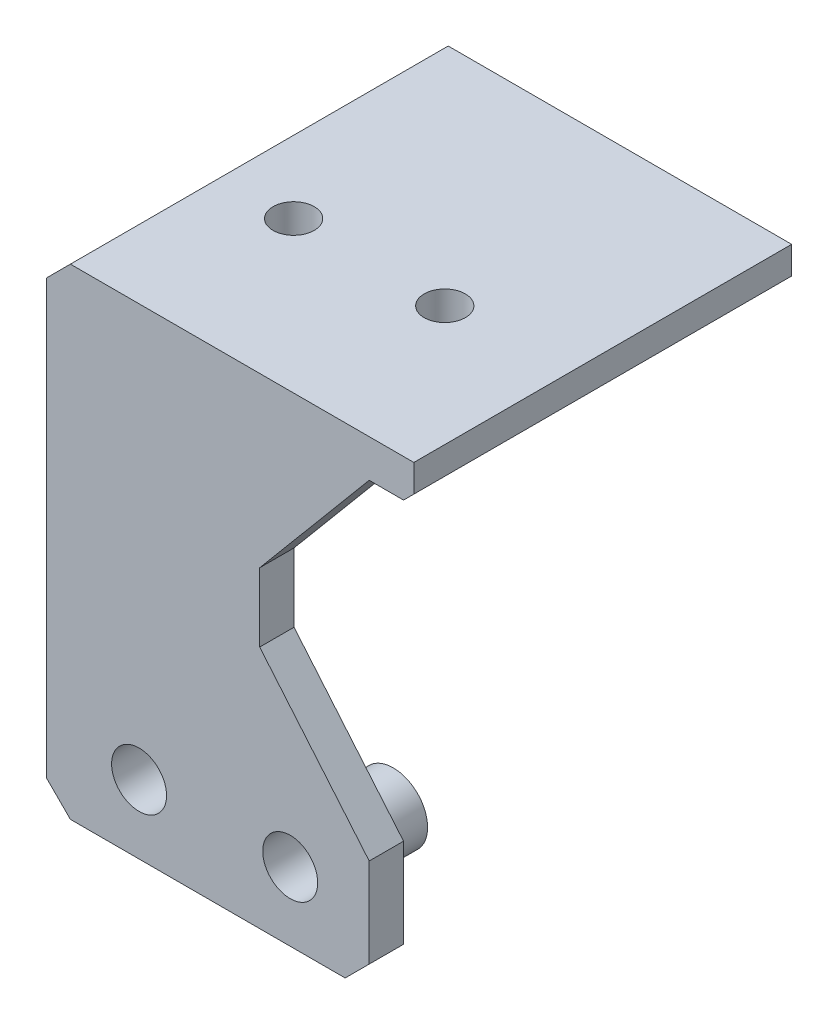
ISO-10303-21;
HEADER;
FILE_DESCRIPTION(('STEP AP214'),'2;1');
FILE_NAME('part.step','',(''),(''),'','','');
FILE_SCHEMA(('AUTOMOTIVE_DESIGN { 1 0 10303 214 1 1 1 1 }'));
ENDSEC;
DATA;
#1=APPLICATION_CONTEXT('core data for automotive mechanical design processes');
#2=APPLICATION_PROTOCOL_DEFINITION('international standard','automotive_design',2000,#1);
#3=PRODUCT_CONTEXT('',#1,'mechanical');
#4=PRODUCT('Part','Part','',(#3));
#5=PRODUCT_RELATED_PRODUCT_CATEGORY('part','',(#4));
#6=PRODUCT_DEFINITION_FORMATION('','',#4);
#7=PRODUCT_DEFINITION_CONTEXT('part definition',#1,'design');
#8=PRODUCT_DEFINITION('design','',#6,#7);
#9=PRODUCT_DEFINITION_SHAPE('','',#8);
#10=(LENGTH_UNIT() NAMED_UNIT(*) SI_UNIT(.MILLI.,.METRE.));
#11=(NAMED_UNIT(*) PLANE_ANGLE_UNIT() SI_UNIT($,.RADIAN.));
#12=(NAMED_UNIT(*) SI_UNIT($,.STERADIAN.) SOLID_ANGLE_UNIT());
#13=UNCERTAINTY_MEASURE_WITH_UNIT(LENGTH_MEASURE(1.E-05),#10,'distance_accuracy_value','');
#14=(GEOMETRIC_REPRESENTATION_CONTEXT(3) GLOBAL_UNCERTAINTY_ASSIGNED_CONTEXT((#13)) GLOBAL_UNIT_ASSIGNED_CONTEXT((#10,
#11,#12)) REPRESENTATION_CONTEXT('',''));
#15=CARTESIAN_POINT('',(0.,0.,0.));
#16=DIRECTION('',(0.,0.,1.));
#17=DIRECTION('',(1.,0.,0.));
#18=AXIS2_PLACEMENT_3D('',#15,#16,#17);
#19=CARTESIAN_POINT('',(10.5,0.,-17.));
#20=DIRECTION('',(0.,-1.,0.));
#21=DIRECTION('',(0.,0.,-1.));
#22=AXIS2_PLACEMENT_3D('',#19,#20,#21);
#23=CYLINDRICAL_SURFACE('',#22,3.);
#24=CARTESIAN_POINT('',(10.5,0.,-17.));
#25=DIRECTION('',(0.,-1.,0.));
#26=DIRECTION('',(0.,0.,-1.));
#27=AXIS2_PLACEMENT_3D('',#24,#25,#26);
#28=CIRCLE('',#27,3.);
#29=CARTESIAN_POINT('',(10.5,0.,-20.));
#30=VERTEX_POINT('',#29);
#31=EDGE_CURVE('E300',#30,#30,#28,.T.);
#32=ORIENTED_EDGE('',*,*,#31,.F.);
#33=EDGE_LOOP('',(#32));
#34=FACE_BOUND('',#33,.T.);
#35=CARTESIAN_POINT('',(10.5,-4.50000000000006,-17.));
#36=DIRECTION('',(0.,-1.,0.));
#37=DIRECTION('',(0.,0.,-1.));
#38=AXIS2_PLACEMENT_3D('',#35,#36,#37);
#39=CIRCLE('',#38,3.);
#40=CARTESIAN_POINT('',(10.5,-4.50000000000006,-20.));
#41=VERTEX_POINT('',#40);
#42=EDGE_CURVE('E360',#41,#41,#39,.T.);
#43=ORIENTED_EDGE('',*,*,#42,.T.);
#44=EDGE_LOOP('',(#43));
#45=FACE_BOUND('',#44,.T.);
#46=ADVANCED_FACE('F66',(#34,#45),#23,.F.);
#47=CARTESIAN_POINT('',(32.5,0.,-17.));
#48=DIRECTION('',(0.,-1.,0.));
#49=DIRECTION('',(0.,0.,-1.));
#50=AXIS2_PLACEMENT_3D('',#47,#48,#49);
#51=CYLINDRICAL_SURFACE('',#50,3.);
#52=CARTESIAN_POINT('',(32.5,0.,-17.));
#53=DIRECTION('',(0.,-1.,0.));
#54=DIRECTION('',(0.,0.,-1.));
#55=AXIS2_PLACEMENT_3D('',#52,#53,#54);
#56=CIRCLE('',#55,3.);
#57=CARTESIAN_POINT('',(32.5,0.,-20.));
#58=VERTEX_POINT('',#57);
#59=EDGE_CURVE('E294',#58,#58,#56,.T.);
#60=ORIENTED_EDGE('',*,*,#59,.F.);
#61=EDGE_LOOP('',(#60));
#62=FACE_BOUND('',#61,.T.);
#63=CARTESIAN_POINT('',(32.5,-4.50000000000006,-17.));
#64=DIRECTION('',(0.,-1.,0.));
#65=DIRECTION('',(0.,0.,-1.));
#66=AXIS2_PLACEMENT_3D('',#63,#64,#65);
#67=CIRCLE('',#66,3.);
#68=CARTESIAN_POINT('',(32.5,-4.50000000000006,-20.));
#69=VERTEX_POINT('',#68);
#70=EDGE_CURVE('E347',#69,#69,#67,.T.);
#71=ORIENTED_EDGE('',*,*,#70,.T.);
#72=EDGE_LOOP('',(#71));
#73=FACE_BOUND('',#72,.T.);
#74=ADVANCED_FACE('F401',(#62,#73),#51,.F.);
#75=CARTESIAN_POINT('',(0.,0.,0.));
#76=DIRECTION('',(0.,0.,1.));
#77=DIRECTION('',(1.,0.,0.));
#78=AXIS2_PLACEMENT_3D('',#75,#76,#77);
#79=PLANE('',#78);
#80=CARTESIAN_POINT('',(10.0000000000001,-59.9999999999999,0.));
#81=DIRECTION('',(0.,0.,1.));
#82=DIRECTION('',(1.,0.,0.));
#83=AXIS2_PLACEMENT_3D('',#80,#81,#82);
#84=CIRCLE('',#83,5.);
#85=CARTESIAN_POINT('',(15.0000000000001,-59.9999999999999,0.));
#86=VERTEX_POINT('',#85);
#87=EDGE_CURVE('E14',#86,#86,#84,.F.);
#88=ORIENTED_EDGE('',*,*,#87,.F.);
#89=EDGE_LOOP('',(#88));
#90=FACE_BOUND('',#89,.T.);
#91=CARTESIAN_POINT('',(32.0000000000001,-59.9999999999999,0.));
#92=DIRECTION('',(0.,0.,1.));
#93=DIRECTION('',(1.,0.,0.));
#94=AXIS2_PLACEMENT_3D('',#91,#92,#93);
#95=CIRCLE('',#94,5.);
#96=CARTESIAN_POINT('',(37.0000000000001,-59.9999999999999,0.));
#97=VERTEX_POINT('',#96);
#98=EDGE_CURVE('E75',#97,#97,#95,.F.);
#99=ORIENTED_EDGE('',*,*,#98,.F.);
#100=EDGE_LOOP('',(#99));
#101=FACE_BOUND('',#100,.T.);
#102=DIRECTION('',(-1.,0.,0.));
#103=VECTOR('',#102,1.);
#104=CARTESIAN_POINT('',(45.5,-8.50000000000006,0.));
#105=LINE('',#104,#103);
#106=CARTESIAN_POINT('',(40.9827011064682,-8.50000000000006,0.));
#107=VERTEX_POINT('',#106);
#108=CARTESIAN_POINT('',(-3.49999999999995,-8.50000000000006,0.));
#109=VERTEX_POINT('',#108);
#110=EDGE_CURVE('E82',#107,#109,#105,.T.);
#111=ORIENTED_EDGE('',*,*,#110,.F.);
#112=DIRECTION('',(0.642787609686536,0.766044443118981,0.));
#113=VECTOR('',#112,1.);
#114=CARTESIAN_POINT('',(28.2350691850395,-23.6920361394314,0.));
#115=LINE('',#114,#113);
#116=CARTESIAN_POINT('',(27.5571070076319,-24.5,0.));
#117=VERTEX_POINT('',#116);
#118=EDGE_CURVE('E223',#117,#107,#115,.T.);
#119=ORIENTED_EDGE('',*,*,#118,.F.);
#120=DIRECTION('',(0.,1.,0.));
#121=VECTOR('',#120,1.);
#122=CARTESIAN_POINT('',(27.5571070076319,0.,0.));
#123=LINE('',#122,#121);
#124=CARTESIAN_POINT('',(27.5571070076319,-34.5,0.));
#125=VERTEX_POINT('',#124);
#126=EDGE_CURVE('E219',#125,#117,#123,.T.);
#127=ORIENTED_EDGE('',*,*,#126,.F.);
#128=DIRECTION('',(-0.642787609686536,0.766044443118981,0.));
#129=VECTOR('',#128,1.);
#130=CARTESIAN_POINT('',(-0.816759528820599,-0.685342619393903,0.));
#131=LINE('',#130,#129);
#132=CARTESIAN_POINT('',(43.5000000000001,-53.5,0.));
#133=VERTEX_POINT('',#132);
#134=EDGE_CURVE('E216',#133,#125,#131,.T.);
#135=ORIENTED_EDGE('',*,*,#134,.F.);
#136=DIRECTION('',(0.,1.,0.));
#137=VECTOR('',#136,1.);
#138=CARTESIAN_POINT('',(43.5,0.,0.));
#139=LINE('',#138,#137);
#140=CARTESIAN_POINT('',(43.5000000000001,-66.5,0.));
#141=VERTEX_POINT('',#140);
#142=EDGE_CURVE('E213',#141,#133,#139,.T.);
#143=ORIENTED_EDGE('',*,*,#142,.F.);
#144=DIRECTION('',(-0.707106781186548,-0.707106781186548,0.));
#145=VECTOR('',#144,1.);
#146=CARTESIAN_POINT('',(55.,-55.,0.));
#147=LINE('',#146,#145);
#148=CARTESIAN_POINT('',(40.0000000000001,-70.,0.));
#149=VERTEX_POINT('',#148);
#150=EDGE_CURVE('E209',#141,#149,#147,.T.);
#151=ORIENTED_EDGE('',*,*,#150,.T.);
#152=DIRECTION('',(1.,0.,0.));
#153=VECTOR('',#152,1.);
#154=CARTESIAN_POINT('',(0.,-70.,0.));
#155=LINE('',#154,#153);
#156=CARTESIAN_POINT('',(1.11022302462516E-13,-70.,0.));
#157=VERTEX_POINT('',#156);
#158=EDGE_CURVE('E205',#157,#149,#155,.T.);
#159=ORIENTED_EDGE('',*,*,#158,.F.);
#160=DIRECTION('',(0.707106781186553,-0.707106781186543,0.));
#161=VECTOR('',#160,1.);
#162=CARTESIAN_POINT('',(-34.9999999999999,-35.0000000000005,0.));
#163=LINE('',#162,#161);
#164=CARTESIAN_POINT('',(-3.49999999999995,-66.5,0.));
#165=VERTEX_POINT('',#164);
#166=EDGE_CURVE('E201',#165,#157,#163,.T.);
#167=ORIENTED_EDGE('',*,*,#166,.F.);
#168=DIRECTION('',(0.,-1.,0.));
#169=VECTOR('',#168,1.);
#170=CARTESIAN_POINT('',(-3.5,0.,0.));
#171=LINE('',#170,#169);
#172=EDGE_CURVE('E198',#109,#165,#171,.T.);
#173=ORIENTED_EDGE('',*,*,#172,.F.);
#174=EDGE_LOOP('',(#111,#119,#127,#135,#143,#151,#159,#167,#173));
#175=FACE_BOUND('',#174,.T.);
#176=ADVANCED_FACE('F407',(#90,#101,#175),#79,.F.);
#177=CARTESIAN_POINT('',(0.,0.,5.));
#178=DIRECTION('',(0.,-1.,0.));
#179=DIRECTION('',(1.,0.,0.));
#180=AXIS2_PLACEMENT_3D('',#177,#178,#179);
#181=PLANE('',#180);
#182=ORIENTED_EDGE('',*,*,#59,.T.);
#183=EDGE_LOOP('',(#182));
#184=FACE_BOUND('',#183,.T.);
#185=ORIENTED_EDGE('',*,*,#31,.T.);
#186=EDGE_LOOP('',(#185));
#187=FACE_BOUND('',#186,.T.);
#188=DIRECTION('',(0.,0.,-1.));
#189=VECTOR('',#188,1.);
#190=CARTESIAN_POINT('',(50.,0.,5.));
#191=LINE('',#190,#189);
#192=CARTESIAN_POINT('',(50.,0.,5.));
#193=VERTEX_POINT('',#192);
#194=CARTESIAN_POINT('',(50.,0.,-50.));
#195=VERTEX_POINT('',#194);
#196=EDGE_CURVE('E194',#193,#195,#191,.T.);
#197=ORIENTED_EDGE('',*,*,#196,.T.);
#198=DIRECTION('',(1.,0.,0.));
#199=VECTOR('',#198,1.);
#200=CARTESIAN_POINT('',(0.,0.,-50.));
#201=LINE('',#200,#199);
#202=CARTESIAN_POINT('',(0.,0.,-50.));
#203=VERTEX_POINT('',#202);
#204=EDGE_CURVE('E284',#203,#195,#201,.T.);
#205=ORIENTED_EDGE('',*,*,#204,.F.);
#206=DIRECTION('',(0.,0.,-1.));
#207=VECTOR('',#206,1.);
#208=CARTESIAN_POINT('',(0.,0.,5.));
#209=LINE('',#208,#207);
#210=CARTESIAN_POINT('',(0.,0.,5.));
#211=VERTEX_POINT('',#210);
#212=EDGE_CURVE('E266',#211,#203,#209,.T.);
#213=ORIENTED_EDGE('',*,*,#212,.F.);
#214=DIRECTION('',(-1.,0.,0.));
#215=VECTOR('',#214,1.);
#216=CARTESIAN_POINT('',(0.,0.,5.));
#217=LINE('',#216,#215);
#218=EDGE_CURVE('E228',#193,#211,#217,.T.);
#219=ORIENTED_EDGE('',*,*,#218,.F.);
#220=EDGE_LOOP('',(#197,#205,#213,#219));
#221=FACE_BOUND('',#220,.T.);
#222=ADVANCED_FACE('F68',(#184,#187,#221),#181,.F.);
#223=CARTESIAN_POINT('',(0.,0.,5.));
#224=DIRECTION('',(0.707106781186553,-0.707106781186543,0.));
#225=DIRECTION('',(0.707106781186543,0.707106781186553,0.));
#226=AXIS2_PLACEMENT_3D('',#223,#224,#225);
#227=PLANE('',#226);
#228=ORIENTED_EDGE('',*,*,#212,.T.);
#229=DIRECTION('',(0.707106781186544,0.707106781186552,0.));
#230=VECTOR('',#229,1.);
#231=CARTESIAN_POINT('',(-3.5,-3.50000000000006,-50.));
#232=LINE('',#231,#230);
#233=CARTESIAN_POINT('',(-3.5,-3.50000000000006,-50.));
#234=VERTEX_POINT('',#233);
#235=EDGE_CURVE('E303',#234,#203,#232,.T.);
#236=ORIENTED_EDGE('',*,*,#235,.F.);
#237=DIRECTION('',(0.,0.,-1.));
#238=VECTOR('',#237,1.);
#239=CARTESIAN_POINT('',(-3.5,-3.50000000000006,5.));
#240=LINE('',#239,#238);
#241=CARTESIAN_POINT('',(-3.5,-3.50000000000006,5.));
#242=VERTEX_POINT('',#241);
#243=EDGE_CURVE('E262',#242,#234,#240,.T.);
#244=ORIENTED_EDGE('',*,*,#243,.F.);
#245=DIRECTION('',(-0.707106781186543,-0.707106781186553,0.));
#246=VECTOR('',#245,1.);
#247=CARTESIAN_POINT('',(0.,0.,5.));
#248=LINE('',#247,#246);
#249=EDGE_CURVE('E137',#211,#242,#248,.T.);
#250=ORIENTED_EDGE('',*,*,#249,.F.);
#251=EDGE_LOOP('',(#228,#236,#244,#250));
#252=FACE_BOUND('',#251,.T.);
#253=ADVANCED_FACE('F464',(#252),#227,.F.);
#254=CARTESIAN_POINT('',(-3.5,0.,5.));
#255=DIRECTION('',(1.,0.,0.));
#256=DIRECTION('',(0.,0.,-1.));
#257=AXIS2_PLACEMENT_3D('',#254,#255,#256);
#258=PLANE('',#257);
#259=ORIENTED_EDGE('',*,*,#243,.T.);
#260=DIRECTION('',(0.,1.,0.));
#261=VECTOR('',#260,1.);
#262=CARTESIAN_POINT('',(-3.49999999999995,-8.50000000000006,-50.));
#263=LINE('',#262,#261);
#264=CARTESIAN_POINT('',(-3.49999999999995,-8.50000000000006,-50.));
#265=VERTEX_POINT('',#264);
#266=EDGE_CURVE('E308',#265,#234,#263,.T.);
#267=ORIENTED_EDGE('',*,*,#266,.F.);
#268=DIRECTION('',(0.,0.,1.));
#269=VECTOR('',#268,1.);
#270=CARTESIAN_POINT('',(-3.49999999999995,-8.50000000000006,-50.));
#271=LINE('',#270,#269);
#272=EDGE_CURVE('E307',#265,#109,#271,.T.);
#273=ORIENTED_EDGE('',*,*,#272,.T.);
#274=ORIENTED_EDGE('',*,*,#172,.T.);
#275=DIRECTION('',(0.,0.,-1.));
#276=VECTOR('',#275,1.);
#277=CARTESIAN_POINT('',(-3.49999999999995,-66.5,5.));
#278=LINE('',#277,#276);
#279=CARTESIAN_POINT('',(-3.49999999999995,-66.5,5.));
#280=VERTEX_POINT('',#279);
#281=EDGE_CURVE('E258',#280,#165,#278,.T.);
#282=ORIENTED_EDGE('',*,*,#281,.F.);
#283=DIRECTION('',(0.,-1.,0.));
#284=VECTOR('',#283,1.);
#285=CARTESIAN_POINT('',(-3.5,0.,5.));
#286=LINE('',#285,#284);
#287=EDGE_CURVE('E502',#242,#280,#286,.T.);
#288=ORIENTED_EDGE('',*,*,#287,.F.);
#289=EDGE_LOOP('',(#259,#267,#273,#274,#282,#288));
#290=FACE_BOUND('',#289,.T.);
#291=ADVANCED_FACE('F461',(#290),#258,.F.);
#292=CARTESIAN_POINT('',(-34.9999999999999,-35.0000000000005,5.));
#293=DIRECTION('',(0.707106781186543,0.707106781186553,0.));
#294=DIRECTION('',(-0.707106781186553,0.707106781186543,0.));
#295=AXIS2_PLACEMENT_3D('',#292,#293,#294);
#296=PLANE('',#295);
#297=ORIENTED_EDGE('',*,*,#166,.T.);
#298=DIRECTION('',(0.,0.,-1.));
#299=VECTOR('',#298,1.);
#300=CARTESIAN_POINT('',(1.11022302462516E-13,-70.,5.));
#301=LINE('',#300,#299);
#302=CARTESIAN_POINT('',(1.11022302462516E-13,-70.,5.));
#303=VERTEX_POINT('',#302);
#304=EDGE_CURVE('E254',#303,#157,#301,.T.);
#305=ORIENTED_EDGE('',*,*,#304,.F.);
#306=DIRECTION('',(0.707106781186553,-0.707106781186543,0.));
#307=VECTOR('',#306,1.);
#308=CARTESIAN_POINT('',(-34.9999999999999,-35.0000000000005,5.));
#309=LINE('',#308,#307);
#310=EDGE_CURVE('E498',#280,#303,#309,.T.);
#311=ORIENTED_EDGE('',*,*,#310,.F.);
#312=ORIENTED_EDGE('',*,*,#281,.T.);
#313=EDGE_LOOP('',(#297,#305,#311,#312));
#314=FACE_BOUND('',#313,.T.);
#315=ADVANCED_FACE('F457',(#314),#296,.F.);
#316=CARTESIAN_POINT('',(0.,-70.,5.));
#317=DIRECTION('',(0.,1.,0.));
#318=DIRECTION('',(0.,0.,1.));
#319=AXIS2_PLACEMENT_3D('',#316,#317,#318);
#320=PLANE('',#319);
#321=ORIENTED_EDGE('',*,*,#158,.T.);
#322=DIRECTION('',(0.,0.,-1.));
#323=VECTOR('',#322,1.);
#324=CARTESIAN_POINT('',(40.0000000000001,-70.,5.));
#325=LINE('',#324,#323);
#326=CARTESIAN_POINT('',(40.0000000000001,-70.,5.));
#327=VERTEX_POINT('',#326);
#328=EDGE_CURVE('E251',#327,#149,#325,.T.);
#329=ORIENTED_EDGE('',*,*,#328,.F.);
#330=DIRECTION('',(1.,0.,0.));
#331=VECTOR('',#330,1.);
#332=CARTESIAN_POINT('',(0.,-70.,5.));
#333=LINE('',#332,#331);
#334=EDGE_CURVE('E501',#303,#327,#333,.T.);
#335=ORIENTED_EDGE('',*,*,#334,.F.);
#336=ORIENTED_EDGE('',*,*,#304,.T.);
#337=EDGE_LOOP('',(#321,#329,#335,#336));
#338=FACE_BOUND('',#337,.T.);
#339=ADVANCED_FACE('F453',(#338),#320,.F.);
#340=CARTESIAN_POINT('',(55.,-55.,5.));
#341=DIRECTION('',(0.707106781186548,-0.707106781186548,0.));
#342=DIRECTION('',(0.707106781186548,0.707106781186548,0.));
#343=AXIS2_PLACEMENT_3D('',#340,#341,#342);
#344=PLANE('',#343);
#345=ORIENTED_EDGE('',*,*,#150,.F.);
#346=DIRECTION('',(0.,0.,-1.));
#347=VECTOR('',#346,1.);
#348=CARTESIAN_POINT('',(43.5000000000001,-66.5,5.));
#349=LINE('',#348,#347);
#350=CARTESIAN_POINT('',(43.5000000000001,-66.5,5.));
#351=VERTEX_POINT('',#350);
#352=EDGE_CURVE('E248',#351,#141,#349,.T.);
#353=ORIENTED_EDGE('',*,*,#352,.F.);
#354=DIRECTION('',(-0.707106781186548,-0.707106781186548,0.));
#355=VECTOR('',#354,1.);
#356=CARTESIAN_POINT('',(55.,-55.,5.));
#357=LINE('',#356,#355);
#358=EDGE_CURVE('E507',#351,#327,#357,.T.);
#359=ORIENTED_EDGE('',*,*,#358,.T.);
#360=ORIENTED_EDGE('',*,*,#328,.T.);
#361=EDGE_LOOP('',(#345,#353,#359,#360));
#362=FACE_BOUND('',#361,.T.);
#363=ADVANCED_FACE('F449',(#362),#344,.T.);
#364=CARTESIAN_POINT('',(43.5,0.,5.));
#365=DIRECTION('',(-1.,0.,0.));
#366=DIRECTION('',(0.,0.,1.));
#367=AXIS2_PLACEMENT_3D('',#364,#365,#366);
#368=PLANE('',#367);
#369=ORIENTED_EDGE('',*,*,#142,.T.);
#370=DIRECTION('',(0.,0.,-1.));
#371=VECTOR('',#370,1.);
#372=CARTESIAN_POINT('',(43.5000000000001,-53.5,5.));
#373=LINE('',#372,#371);
#374=CARTESIAN_POINT('',(43.5000000000001,-53.5,5.));
#375=VERTEX_POINT('',#374);
#376=EDGE_CURVE('E244',#375,#133,#373,.T.);
#377=ORIENTED_EDGE('',*,*,#376,.F.);
#378=DIRECTION('',(0.,1.,0.));
#379=VECTOR('',#378,1.);
#380=CARTESIAN_POINT('',(43.5,0.,5.));
#381=LINE('',#380,#379);
#382=EDGE_CURVE('E515',#351,#375,#381,.T.);
#383=ORIENTED_EDGE('',*,*,#382,.F.);
#384=ORIENTED_EDGE('',*,*,#352,.T.);
#385=EDGE_LOOP('',(#369,#377,#383,#384));
#386=FACE_BOUND('',#385,.T.);
#387=ADVANCED_FACE('F445',(#386),#368,.F.);
#388=CARTESIAN_POINT('',(-0.816759528820599,-0.685342619393903,5.));
#389=DIRECTION('',(-0.766044443118981,-0.642787609686536,0.));
#390=DIRECTION('',(0.642787609686536,-0.766044443118981,0.));
#391=AXIS2_PLACEMENT_3D('',#388,#389,#390);
#392=PLANE('',#391);
#393=ORIENTED_EDGE('',*,*,#134,.T.);
#394=DIRECTION('',(0.,0.,-1.));
#395=VECTOR('',#394,1.);
#396=CARTESIAN_POINT('',(27.5571070076319,-34.5,5.));
#397=LINE('',#396,#395);
#398=CARTESIAN_POINT('',(27.5571070076319,-34.5,5.));
#399=VERTEX_POINT('',#398);
#400=EDGE_CURVE('E240',#399,#125,#397,.T.);
#401=ORIENTED_EDGE('',*,*,#400,.F.);
#402=DIRECTION('',(-0.642787609686536,0.766044443118981,0.));
#403=VECTOR('',#402,1.);
#404=CARTESIAN_POINT('',(-0.816759528820599,-0.685342619393903,5.));
#405=LINE('',#404,#403);
#406=EDGE_CURVE('E518',#375,#399,#405,.T.);
#407=ORIENTED_EDGE('',*,*,#406,.F.);
#408=ORIENTED_EDGE('',*,*,#376,.T.);
#409=EDGE_LOOP('',(#393,#401,#407,#408));
#410=FACE_BOUND('',#409,.T.);
#411=ADVANCED_FACE('F441',(#410),#392,.F.);
#412=CARTESIAN_POINT('',(27.5571070076319,0.,5.));
#413=DIRECTION('',(-1.,0.,0.));
#414=DIRECTION('',(0.,0.,1.));
#415=AXIS2_PLACEMENT_3D('',#412,#413,#414);
#416=PLANE('',#415);
#417=ORIENTED_EDGE('',*,*,#126,.T.);
#418=DIRECTION('',(0.,0.,-1.));
#419=VECTOR('',#418,1.);
#420=CARTESIAN_POINT('',(27.5571070076319,-24.5,5.));
#421=LINE('',#420,#419);
#422=CARTESIAN_POINT('',(27.5571070076319,-24.5,5.));
#423=VERTEX_POINT('',#422);
#424=EDGE_CURVE('E236',#423,#117,#421,.T.);
#425=ORIENTED_EDGE('',*,*,#424,.F.);
#426=DIRECTION('',(0.,1.,0.));
#427=VECTOR('',#426,1.);
#428=CARTESIAN_POINT('',(27.5571070076319,0.,5.));
#429=LINE('',#428,#427);
#430=EDGE_CURVE('E521',#399,#423,#429,.T.);
#431=ORIENTED_EDGE('',*,*,#430,.F.);
#432=ORIENTED_EDGE('',*,*,#400,.T.);
#433=EDGE_LOOP('',(#417,#425,#431,#432));
#434=FACE_BOUND('',#433,.T.);
#435=ADVANCED_FACE('F437',(#434),#416,.F.);
#436=CARTESIAN_POINT('',(28.2350691850395,-23.6920361394314,5.));
#437=DIRECTION('',(-0.766044443118981,0.642787609686536,0.));
#438=DIRECTION('',(-0.642787609686536,-0.766044443118981,0.));
#439=AXIS2_PLACEMENT_3D('',#436,#437,#438);
#440=PLANE('',#439);
#441=ORIENTED_EDGE('',*,*,#118,.T.);
#442=CARTESIAN_POINT('',(43.5,-5.49999999999995,0.));
#443=VERTEX_POINT('',#442);
#444=EDGE_CURVE('E222',#107,#443,#115,.T.);
#445=ORIENTED_EDGE('',*,*,#444,.T.);
#446=DIRECTION('',(0.,0.,-1.));
#447=VECTOR('',#446,1.);
#448=CARTESIAN_POINT('',(43.5,-5.49999999999995,5.));
#449=LINE('',#448,#447);
#450=CARTESIAN_POINT('',(43.5,-5.49999999999995,5.));
#451=VERTEX_POINT('',#450);
#452=EDGE_CURVE('E184',#451,#443,#449,.T.);
#453=ORIENTED_EDGE('',*,*,#452,.F.);
#454=DIRECTION('',(0.642787609686536,0.766044443118981,0.));
#455=VECTOR('',#454,1.);
#456=CARTESIAN_POINT('',(28.2350691850395,-23.6920361394314,5.));
#457=LINE('',#456,#455);
#458=EDGE_CURVE('E174',#423,#451,#457,.T.);
#459=ORIENTED_EDGE('',*,*,#458,.F.);
#460=ORIENTED_EDGE('',*,*,#424,.T.);
#461=EDGE_LOOP('',(#441,#445,#453,#459,#460));
#462=FACE_BOUND('',#461,.T.);
#463=ADVANCED_FACE('F434',(#462),#440,.F.);
#464=CARTESIAN_POINT('',(0.,-5.50000000000006,5.));
#465=DIRECTION('',(0.,1.,0.));
#466=DIRECTION('',(-1.,0.,0.));
#467=AXIS2_PLACEMENT_3D('',#464,#465,#466);
#468=PLANE('',#467);
#469=DIRECTION('',(1.,0.,0.));
#470=VECTOR('',#469,1.);
#471=CARTESIAN_POINT('',(0.,-5.50000000000006,0.));
#472=LINE('',#471,#470);
#473=CARTESIAN_POINT('',(48.5,-5.49999999999995,0.));
#474=VERTEX_POINT('',#473);
#475=EDGE_CURVE('E128',#443,#474,#472,.T.);
#476=ORIENTED_EDGE('',*,*,#475,.T.);
#477=DIRECTION('',(0.,0.,-1.));
#478=VECTOR('',#477,1.);
#479=CARTESIAN_POINT('',(48.5,-5.49999999999995,5.));
#480=LINE('',#479,#478);
#481=CARTESIAN_POINT('',(48.5,-5.49999999999995,5.));
#482=VERTEX_POINT('',#481);
#483=EDGE_CURVE('E178',#482,#474,#480,.T.);
#484=ORIENTED_EDGE('',*,*,#483,.F.);
#485=DIRECTION('',(1.,0.,0.));
#486=VECTOR('',#485,1.);
#487=CARTESIAN_POINT('',(0.,-5.50000000000006,5.));
#488=LINE('',#487,#486);
#489=EDGE_CURVE('E168',#451,#482,#488,.T.);
#490=ORIENTED_EDGE('',*,*,#489,.F.);
#491=ORIENTED_EDGE('',*,*,#452,.T.);
#492=EDGE_LOOP('',(#476,#484,#490,#491));
#493=FACE_BOUND('',#492,.T.);
#494=ADVANCED_FACE('F179',(#493),#468,.F.);
#495=CARTESIAN_POINT('',(27.0000000000003,-27.,5.));
#496=DIRECTION('',(-0.707106781186551,0.707106781186544,0.));
#497=DIRECTION('',(-0.707106781186544,-0.707106781186551,0.));
#498=AXIS2_PLACEMENT_3D('',#495,#496,#497);
#499=PLANE('',#498);
#500=ORIENTED_EDGE('',*,*,#483,.T.);
#501=DIRECTION('',(-0.707106781186546,-0.707106781186549,0.));
#502=VECTOR('',#501,1.);
#503=CARTESIAN_POINT('',(50.,-4.,0.));
#504=LINE('',#503,#502);
#505=CARTESIAN_POINT('',(45.5,-8.50000000000006,0.));
#506=VERTEX_POINT('',#505);
#507=EDGE_CURVE('E285',#474,#506,#504,.T.);
#508=ORIENTED_EDGE('',*,*,#507,.T.);
#509=DIRECTION('',(0.,0.,1.));
#510=VECTOR('',#509,1.);
#511=CARTESIAN_POINT('',(45.5,-8.50000000000006,-50.));
#512=LINE('',#511,#510);
#513=CARTESIAN_POINT('',(45.5,-8.50000000000006,-50.));
#514=VERTEX_POINT('',#513);
#515=EDGE_CURVE('E202',#514,#506,#512,.T.);
#516=ORIENTED_EDGE('',*,*,#515,.F.);
#517=DIRECTION('',(-0.707106781186546,-0.707106781186549,0.));
#518=VECTOR('',#517,1.);
#519=CARTESIAN_POINT('',(50.,-4.,-50.));
#520=LINE('',#519,#518);
#521=CARTESIAN_POINT('',(50.,-4.,-50.));
#522=VERTEX_POINT('',#521);
#523=EDGE_CURVE('E316',#522,#514,#520,.T.);
#524=ORIENTED_EDGE('',*,*,#523,.F.);
#525=DIRECTION('',(0.,0.,-1.));
#526=VECTOR('',#525,1.);
#527=CARTESIAN_POINT('',(50.,-4.,5.));
#528=LINE('',#527,#526);
#529=CARTESIAN_POINT('',(50.,-4.,5.));
#530=VERTEX_POINT('',#529);
#531=EDGE_CURVE('E185',#530,#522,#528,.T.);
#532=ORIENTED_EDGE('',*,*,#531,.F.);
#533=DIRECTION('',(0.707106781186544,0.707106781186551,0.));
#534=VECTOR('',#533,1.);
#535=CARTESIAN_POINT('',(27.0000000000003,-27.,5.));
#536=LINE('',#535,#534);
#537=EDGE_CURVE('E171',#482,#530,#536,.T.);
#538=ORIENTED_EDGE('',*,*,#537,.F.);
#539=EDGE_LOOP('',(#500,#508,#516,#524,#532,#538));
#540=FACE_BOUND('',#539,.T.);
#541=ADVANCED_FACE('F187',(#540),#499,.F.);
#542=CARTESIAN_POINT('',(50.,0.,5.));
#543=DIRECTION('',(-1.,0.,0.));
#544=DIRECTION('',(0.,0.,1.));
#545=AXIS2_PLACEMENT_3D('',#542,#543,#544);
#546=PLANE('',#545);
#547=ORIENTED_EDGE('',*,*,#531,.T.);
#548=DIRECTION('',(0.,-1.,0.));
#549=VECTOR('',#548,1.);
#550=CARTESIAN_POINT('',(50.,0.,-50.));
#551=LINE('',#550,#549);
#552=EDGE_CURVE('E292',#195,#522,#551,.T.);
#553=ORIENTED_EDGE('',*,*,#552,.F.);
#554=ORIENTED_EDGE('',*,*,#196,.F.);
#555=DIRECTION('',(0.,1.,0.));
#556=VECTOR('',#555,1.);
#557=CARTESIAN_POINT('',(50.,0.,5.));
#558=LINE('',#557,#556);
#559=EDGE_CURVE('E91',#530,#193,#558,.T.);
#560=ORIENTED_EDGE('',*,*,#559,.F.);
#561=EDGE_LOOP('',(#547,#553,#554,#560));
#562=FACE_BOUND('',#561,.T.);
#563=ADVANCED_FACE('F378',(#562),#546,.F.);
#564=CARTESIAN_POINT('',(0.,0.,5.));
#565=DIRECTION('',(0.,0.,1.));
#566=DIRECTION('',(1.,0.,0.));
#567=AXIS2_PLACEMENT_3D('',#564,#565,#566);
#568=PLANE('',#567);
#569=CARTESIAN_POINT('',(10.0000000000001,-59.9999999999999,5.));
#570=DIRECTION('',(0.,0.,1.));
#571=DIRECTION('',(1.,0.,0.));
#572=AXIS2_PLACEMENT_3D('',#569,#570,#571);
#573=CIRCLE('',#572,4.00000000000001);
#574=CARTESIAN_POINT('',(14.0000000000001,-59.9999999999999,5.));
#575=VERTEX_POINT('',#574);
#576=EDGE_CURVE('E348',#575,#575,#573,.T.);
#577=ORIENTED_EDGE('',*,*,#576,.F.);
#578=EDGE_LOOP('',(#577));
#579=FACE_BOUND('',#578,.T.);
#580=CARTESIAN_POINT('',(32.0000000000001,-59.9999999999999,5.));
#581=DIRECTION('',(0.,0.,1.));
#582=DIRECTION('',(1.,0.,0.));
#583=AXIS2_PLACEMENT_3D('',#580,#581,#582);
#584=CIRCLE('',#583,4.);
#585=CARTESIAN_POINT('',(36.0000000000001,-59.9999999999999,5.));
#586=VERTEX_POINT('',#585);
#587=EDGE_CURVE('E367',#586,#586,#584,.T.);
#588=ORIENTED_EDGE('',*,*,#587,.F.);
#589=EDGE_LOOP('',(#588));
#590=FACE_BOUND('',#589,.T.);
#591=ORIENTED_EDGE('',*,*,#218,.T.);
#592=ORIENTED_EDGE('',*,*,#249,.T.);
#593=ORIENTED_EDGE('',*,*,#287,.T.);
#594=ORIENTED_EDGE('',*,*,#310,.T.);
#595=ORIENTED_EDGE('',*,*,#334,.T.);
#596=ORIENTED_EDGE('',*,*,#358,.F.);
#597=ORIENTED_EDGE('',*,*,#382,.T.);
#598=ORIENTED_EDGE('',*,*,#406,.T.);
#599=ORIENTED_EDGE('',*,*,#430,.T.);
#600=ORIENTED_EDGE('',*,*,#458,.T.);
#601=ORIENTED_EDGE('',*,*,#489,.T.);
#602=ORIENTED_EDGE('',*,*,#537,.T.);
#603=ORIENTED_EDGE('',*,*,#559,.T.);
#604=EDGE_LOOP('',(#591,#592,#593,#594,#595,#596,#597,#598,#599,#600,#601,#602,#603));
#605=FACE_BOUND('',#604,.T.);
#606=ADVANCED_FACE('F169',(#579,#590,#605),#568,.T.);
#607=CARTESIAN_POINT('',(45.5,-8.50000000000006,-50.));
#608=DIRECTION('',(0.,1.,0.));
#609=DIRECTION('',(0.,0.,1.));
#610=AXIS2_PLACEMENT_3D('',#607,#608,#609);
#611=PLANE('',#610);
#612=CARTESIAN_POINT('',(10.5000000000001,-8.50000000000006,-17.));
#613=DIRECTION('',(0.,-1.,0.));
#614=DIRECTION('',(0.,0.,-1.));
#615=AXIS2_PLACEMENT_3D('',#612,#613,#614);
#616=CIRCLE('',#615,5.);
#617=CARTESIAN_POINT('',(10.5000000000001,-8.50000000000006,-22.));
#618=VERTEX_POINT('',#617);
#619=EDGE_CURVE('E353',#618,#618,#616,.T.);
#620=ORIENTED_EDGE('',*,*,#619,.F.);
#621=EDGE_LOOP('',(#620));
#622=FACE_BOUND('',#621,.T.);
#623=CARTESIAN_POINT('',(32.5000000000001,-8.50000000000006,-17.));
#624=DIRECTION('',(0.,-1.,0.));
#625=DIRECTION('',(0.,0.,-1.));
#626=AXIS2_PLACEMENT_3D('',#623,#624,#625);
#627=CIRCLE('',#626,5.);
#628=CARTESIAN_POINT('',(32.5000000000001,-8.50000000000006,-22.));
#629=VERTEX_POINT('',#628);
#630=EDGE_CURVE('E343',#629,#629,#627,.T.);
#631=ORIENTED_EDGE('',*,*,#630,.F.);
#632=EDGE_LOOP('',(#631));
#633=FACE_BOUND('',#632,.T.);
#634=EDGE_CURVE('E275',#506,#107,#105,.T.);
#635=ORIENTED_EDGE('',*,*,#634,.T.);
#636=ORIENTED_EDGE('',*,*,#110,.T.);
#637=ORIENTED_EDGE('',*,*,#272,.F.);
#638=DIRECTION('',(-1.,0.,0.));
#639=VECTOR('',#638,1.);
#640=CARTESIAN_POINT('',(45.5,-8.50000000000006,-50.));
#641=LINE('',#640,#639);
#642=EDGE_CURVE('E312',#514,#265,#641,.T.);
#643=ORIENTED_EDGE('',*,*,#642,.F.);
#644=ORIENTED_EDGE('',*,*,#515,.T.);
#645=EDGE_LOOP('',(#635,#636,#637,#643,#644));
#646=FACE_BOUND('',#645,.T.);
#647=ADVANCED_FACE('F377',(#622,#633,#646),#611,.F.);
#648=CARTESIAN_POINT('',(0.,0.,-50.));
#649=DIRECTION('',(0.,0.,-1.));
#650=DIRECTION('',(-1.,0.,0.));
#651=AXIS2_PLACEMENT_3D('',#648,#649,#650);
#652=PLANE('',#651);
#653=ORIENTED_EDGE('',*,*,#204,.T.);
#654=ORIENTED_EDGE('',*,*,#552,.T.);
#655=ORIENTED_EDGE('',*,*,#523,.T.);
#656=ORIENTED_EDGE('',*,*,#642,.T.);
#657=ORIENTED_EDGE('',*,*,#266,.T.);
#658=ORIENTED_EDGE('',*,*,#235,.T.);
#659=EDGE_LOOP('',(#653,#654,#655,#656,#657,#658));
#660=FACE_BOUND('',#659,.T.);
#661=ADVANCED_FACE('F413',(#660),#652,.T.);
#662=CARTESIAN_POINT('',(0.,0.,0.));
#663=DIRECTION('',(0.,0.,-1.));
#664=DIRECTION('',(-1.,0.,0.));
#665=AXIS2_PLACEMENT_3D('',#662,#663,#664);
#666=PLANE('',#665);
#667=ORIENTED_EDGE('',*,*,#475,.F.);
#668=ORIENTED_EDGE('',*,*,#444,.F.);
#669=ORIENTED_EDGE('',*,*,#634,.F.);
#670=ORIENTED_EDGE('',*,*,#507,.F.);
#671=EDGE_LOOP('',(#667,#668,#669,#670));
#672=FACE_BOUND('',#671,.T.);
#673=ADVANCED_FACE('F416',(#672),#666,.F.);
#674=CARTESIAN_POINT('',(32.0000000000001,-59.9999999999999,-10.));
#675=DIRECTION('',(0.,0.,-1.));
#676=DIRECTION('',(-1.,0.,0.));
#677=AXIS2_PLACEMENT_3D('',#674,#675,#676);
#678=PLANE('',#677);
#679=CARTESIAN_POINT('',(32.0000000000001,-59.9999999999999,-10.));
#680=DIRECTION('',(0.,0.,-1.));
#681=DIRECTION('',(-1.,0.,0.));
#682=AXIS2_PLACEMENT_3D('',#679,#680,#681);
#683=CIRCLE('',#682,5.);
#684=CARTESIAN_POINT('',(27.0000000000001,-59.9999999999999,-10.));
#685=VERTEX_POINT('',#684);
#686=EDGE_CURVE('E325',#685,#685,#683,.T.);
#687=ORIENTED_EDGE('',*,*,#686,.T.);
#688=EDGE_LOOP('',(#687));
#689=FACE_BOUND('',#688,.T.);
#690=CARTESIAN_POINT('',(32.0000000000001,-59.9999999999999,-10.));
#691=DIRECTION('',(0.,0.,-1.));
#692=DIRECTION('',(-1.,0.,0.));
#693=AXIS2_PLACEMENT_3D('',#690,#691,#692);
#694=CIRCLE('',#693,4.);
#695=CARTESIAN_POINT('',(28.0000000000001,-59.9999999999999,-10.));
#696=VERTEX_POINT('',#695);
#697=EDGE_CURVE('E330',#696,#696,#694,.T.);
#698=ORIENTED_EDGE('',*,*,#697,.F.);
#699=EDGE_LOOP('',(#698));
#700=FACE_BOUND('',#699,.T.);
#701=ADVANCED_FACE('F395',(#689,#700),#678,.T.);
#702=CARTESIAN_POINT('',(32.0000000000001,-59.9999999999999,-10.));
#703=DIRECTION('',(0.,0.,1.));
#704=DIRECTION('',(1.,0.,0.));
#705=AXIS2_PLACEMENT_3D('',#702,#703,#704);
#706=CYLINDRICAL_SURFACE('',#705,5.);
#707=ORIENTED_EDGE('',*,*,#686,.F.);
#708=EDGE_LOOP('',(#707));
#709=FACE_BOUND('',#708,.T.);
#710=ORIENTED_EDGE('',*,*,#98,.T.);
#711=EDGE_LOOP('',(#710));
#712=FACE_BOUND('',#711,.T.);
#713=ADVANCED_FACE('F385',(#709,#712),#706,.T.);
#714=CARTESIAN_POINT('',(32.0000000000001,-59.9999999999999,-10.));
#715=DIRECTION('',(0.,0.,1.));
#716=DIRECTION('',(1.,0.,0.));
#717=AXIS2_PLACEMENT_3D('',#714,#715,#716);
#718=CYLINDRICAL_SURFACE('',#717,4.);
#719=ORIENTED_EDGE('',*,*,#697,.T.);
#720=EDGE_LOOP('',(#719));
#721=FACE_BOUND('',#720,.T.);
#722=ORIENTED_EDGE('',*,*,#587,.T.);
#723=EDGE_LOOP('',(#722));
#724=FACE_BOUND('',#723,.T.);
#725=ADVANCED_FACE('F382',(#721,#724),#718,.F.);
#726=CARTESIAN_POINT('',(10.0000000000001,-59.9999999999999,-10.));
#727=DIRECTION('',(0.,0.,-1.));
#728=DIRECTION('',(-1.,0.,0.));
#729=AXIS2_PLACEMENT_3D('',#726,#727,#728);
#730=PLANE('',#729);
#731=CARTESIAN_POINT('',(10.0000000000001,-59.9999999999999,-10.));
#732=DIRECTION('',(0.,0.,-1.));
#733=DIRECTION('',(-1.,0.,0.));
#734=AXIS2_PLACEMENT_3D('',#731,#732,#733);
#735=CIRCLE('',#734,5.);
#736=CARTESIAN_POINT('',(5.00000000000006,-59.9999999999999,-10.));
#737=VERTEX_POINT('',#736);
#738=EDGE_CURVE('E338',#737,#737,#735,.T.);
#739=ORIENTED_EDGE('',*,*,#738,.T.);
#740=EDGE_LOOP('',(#739));
#741=FACE_BOUND('',#740,.T.);
#742=CARTESIAN_POINT('',(10.0000000000001,-59.9999999999999,-10.));
#743=DIRECTION('',(0.,0.,-1.));
#744=DIRECTION('',(-1.,0.,0.));
#745=AXIS2_PLACEMENT_3D('',#742,#743,#744);
#746=CIRCLE('',#745,4.00000000000001);
#747=CARTESIAN_POINT('',(6.00000000000006,-59.9999999999999,-10.));
#748=VERTEX_POINT('',#747);
#749=EDGE_CURVE('E334',#748,#748,#746,.T.);
#750=ORIENTED_EDGE('',*,*,#749,.F.);
#751=EDGE_LOOP('',(#750));
#752=FACE_BOUND('',#751,.T.);
#753=ADVANCED_FACE('F384',(#741,#752),#730,.T.);
#754=CARTESIAN_POINT('',(10.0000000000001,-59.9999999999999,-10.));
#755=DIRECTION('',(0.,0.,1.));
#756=DIRECTION('',(1.,0.,0.));
#757=AXIS2_PLACEMENT_3D('',#754,#755,#756);
#758=CYLINDRICAL_SURFACE('',#757,5.);
#759=ORIENTED_EDGE('',*,*,#738,.F.);
#760=EDGE_LOOP('',(#759));
#761=FACE_BOUND('',#760,.T.);
#762=ORIENTED_EDGE('',*,*,#87,.T.);
#763=EDGE_LOOP('',(#762));
#764=FACE_BOUND('',#763,.T.);
#765=ADVANCED_FACE('F392',(#761,#764),#758,.T.);
#766=CARTESIAN_POINT('',(10.0000000000001,-59.9999999999999,-10.));
#767=DIRECTION('',(0.,0.,1.));
#768=DIRECTION('',(1.,0.,0.));
#769=AXIS2_PLACEMENT_3D('',#766,#767,#768);
#770=CYLINDRICAL_SURFACE('',#769,4.00000000000001);
#771=ORIENTED_EDGE('',*,*,#749,.T.);
#772=EDGE_LOOP('',(#771));
#773=FACE_BOUND('',#772,.T.);
#774=ORIENTED_EDGE('',*,*,#576,.T.);
#775=EDGE_LOOP('',(#774));
#776=FACE_BOUND('',#775,.T.);
#777=ADVANCED_FACE('F373',(#773,#776),#770,.F.);
#778=CARTESIAN_POINT('',(32.5,-4.50000000000006,-17.));
#779=DIRECTION('',(0.,-1.,0.));
#780=DIRECTION('',(0.,0.,-1.));
#781=AXIS2_PLACEMENT_3D('',#778,#779,#780);
#782=CYLINDRICAL_SURFACE('',#781,5.);
#783=CARTESIAN_POINT('',(32.5,-4.50000000000006,-17.));
#784=DIRECTION('',(0.,-1.,0.));
#785=DIRECTION('',(0.,0.,-1.));
#786=AXIS2_PLACEMENT_3D('',#783,#784,#785);
#787=CIRCLE('',#786,5.);
#788=CARTESIAN_POINT('',(32.5,-4.50000000000006,-22.));
#789=VERTEX_POINT('',#788);
#790=EDGE_CURVE('E349',#789,#789,#787,.T.);
#791=ORIENTED_EDGE('',*,*,#790,.F.);
#792=EDGE_LOOP('',(#791));
#793=FACE_BOUND('',#792,.T.);
#794=ORIENTED_EDGE('',*,*,#630,.T.);
#795=EDGE_LOOP('',(#794));
#796=FACE_BOUND('',#795,.T.);
#797=ADVANCED_FACE('F581',(#793,#796),#782,.F.);
#798=CARTESIAN_POINT('',(0.,-4.50000000000006,0.));
#799=DIRECTION('',(0.,-1.,0.));
#800=DIRECTION('',(0.,0.,-1.));
#801=AXIS2_PLACEMENT_3D('',#798,#799,#800);
#802=PLANE('',#801);
#803=ORIENTED_EDGE('',*,*,#70,.F.);
#804=EDGE_LOOP('',(#803));
#805=FACE_BOUND('',#804,.T.);
#806=ORIENTED_EDGE('',*,*,#790,.T.);
#807=EDGE_LOOP('',(#806));
#808=FACE_BOUND('',#807,.T.);
#809=ADVANCED_FACE('F577',(#805,#808),#802,.T.);
#810=CARTESIAN_POINT('',(10.5,-4.50000000000006,-17.));
#811=DIRECTION('',(0.,-1.,0.));
#812=DIRECTION('',(0.,0.,-1.));
#813=AXIS2_PLACEMENT_3D('',#810,#811,#812);
#814=CYLINDRICAL_SURFACE('',#813,5.);
#815=CARTESIAN_POINT('',(10.5,-4.50000000000006,-17.));
#816=DIRECTION('',(0.,-1.,0.));
#817=DIRECTION('',(0.,0.,-1.));
#818=AXIS2_PLACEMENT_3D('',#815,#816,#817);
#819=CIRCLE('',#818,5.);
#820=CARTESIAN_POINT('',(10.5,-4.50000000000006,-22.));
#821=VERTEX_POINT('',#820);
#822=EDGE_CURVE('E342',#821,#821,#819,.T.);
#823=ORIENTED_EDGE('',*,*,#822,.F.);
#824=EDGE_LOOP('',(#823));
#825=FACE_BOUND('',#824,.T.);
#826=ORIENTED_EDGE('',*,*,#619,.T.);
#827=EDGE_LOOP('',(#826));
#828=FACE_BOUND('',#827,.T.);
#829=ADVANCED_FACE('F580',(#825,#828),#814,.F.);
#830=CARTESIAN_POINT('',(0.,-4.50000000000006,0.));
#831=DIRECTION('',(0.,-1.,0.));
#832=DIRECTION('',(0.,0.,-1.));
#833=AXIS2_PLACEMENT_3D('',#830,#831,#832);
#834=PLANE('',#833);
#835=ORIENTED_EDGE('',*,*,#42,.F.);
#836=EDGE_LOOP('',(#835));
#837=FACE_BOUND('',#836,.T.);
#838=ORIENTED_EDGE('',*,*,#822,.T.);
#839=EDGE_LOOP('',(#838));
#840=FACE_BOUND('',#839,.T.);
#841=ADVANCED_FACE('F633',(#837,#840),#834,.T.);
#842=CLOSED_SHELL('',(#46,#74,#176,#222,#253,#291,#315,#339,#363,#387,#411,#435,#463,#494,#541,
#563,#606,#647,#661,#673,#701,#713,#725,#753,#765,#777,#797,#809,#829,#841));
#843=MANIFOLD_SOLID_BREP('B2',#842);
#844=ADVANCED_BREP_SHAPE_REPRESENTATION('',(#18,#843),#14);
#845=SHAPE_DEFINITION_REPRESENTATION(#9,#844);
ENDSEC;
END-ISO-10303-21;
